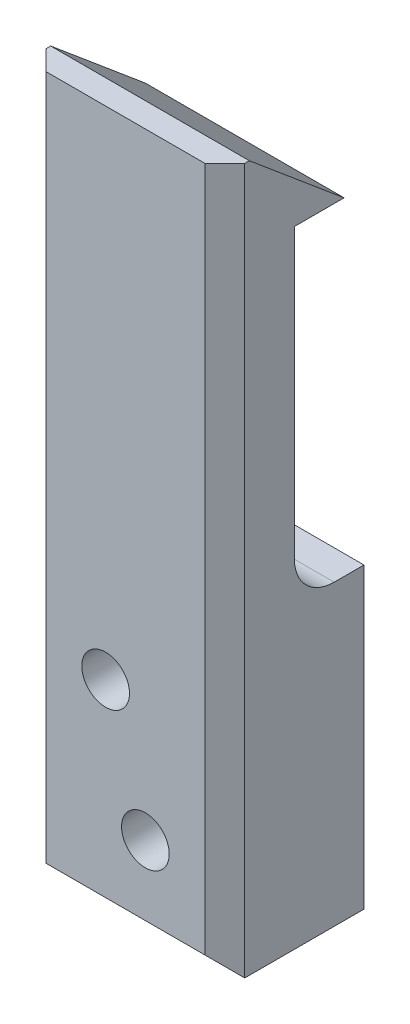
ISO-10303-21;
HEADER;
FILE_DESCRIPTION(('STEP AP214'),'2;1');
FILE_NAME('part.step','',(''),(''),'','','');
FILE_SCHEMA(('AUTOMOTIVE_DESIGN { 1 0 10303 214 1 1 1 1 }'));
ENDSEC;
DATA;
#1=APPLICATION_CONTEXT('core data for automotive mechanical design processes');
#2=APPLICATION_PROTOCOL_DEFINITION('international standard','automotive_design',2000,#1);
#3=PRODUCT_CONTEXT('',#1,'mechanical');
#4=PRODUCT('Part','Part','',(#3));
#5=PRODUCT_RELATED_PRODUCT_CATEGORY('part','',(#4));
#6=PRODUCT_DEFINITION_FORMATION('','',#4);
#7=PRODUCT_DEFINITION_CONTEXT('part definition',#1,'design');
#8=PRODUCT_DEFINITION('design','',#6,#7);
#9=PRODUCT_DEFINITION_SHAPE('','',#8);
#10=(LENGTH_UNIT() NAMED_UNIT(*) SI_UNIT(.MILLI.,.METRE.));
#11=(NAMED_UNIT(*) PLANE_ANGLE_UNIT() SI_UNIT($,.RADIAN.));
#12=(NAMED_UNIT(*) SI_UNIT($,.STERADIAN.) SOLID_ANGLE_UNIT());
#13=UNCERTAINTY_MEASURE_WITH_UNIT(LENGTH_MEASURE(1.E-05),#10,'distance_accuracy_value','');
#14=(GEOMETRIC_REPRESENTATION_CONTEXT(3) GLOBAL_UNCERTAINTY_ASSIGNED_CONTEXT((#13)) GLOBAL_UNIT_ASSIGNED_CONTEXT((#10,
#11,#12)) REPRESENTATION_CONTEXT('',''));
#15=CARTESIAN_POINT('',(0.,0.,0.));
#16=DIRECTION('',(0.,0.,1.));
#17=DIRECTION('',(1.,0.,0.));
#18=AXIS2_PLACEMENT_3D('',#15,#16,#17);
#19=CARTESIAN_POINT('',(-7.00000000000002,-14.0000000000004,1.49999999999998));
#20=DIRECTION('',(1.,0.,0.));
#21=DIRECTION('',(0.,1.,0.));
#22=AXIS2_PLACEMENT_3D('',#19,#20,#21);
#23=CYLINDRICAL_SURFACE('',#22,2.);
#24=CARTESIAN_POINT('',(2.99999999999999,-14.0000000000004,1.49999999999998));
#25=DIRECTION('',(1.,0.,0.));
#26=DIRECTION('',(0.,1.,0.));
#27=AXIS2_PLACEMENT_3D('',#24,#25,#26);
#28=CIRCLE('',#27,2.);
#29=CARTESIAN_POINT('',(2.99999999999999,-14.0000000000004,3.49999999999998));
#30=VERTEX_POINT('',#29);
#31=CARTESIAN_POINT('',(2.99999999999999,-16.0000000000004,1.49999999999997));
#32=VERTEX_POINT('',#31);
#33=EDGE_CURVE('E167',#30,#32,#28,.T.);
#34=ORIENTED_EDGE('',*,*,#33,.T.);
#35=DIRECTION('',(1.,0.,0.));
#36=VECTOR('',#35,1.);
#37=CARTESIAN_POINT('',(-7.00000000000001,-16.0000000000004,1.49999999999996));
#38=LINE('',#37,#36);
#39=CARTESIAN_POINT('',(-7.00000000000001,-16.0000000000004,1.49999999999996));
#40=VERTEX_POINT('',#39);
#41=EDGE_CURVE('E147',#40,#32,#38,.T.);
#42=ORIENTED_EDGE('',*,*,#41,.F.);
#43=CARTESIAN_POINT('',(-7.00000000000002,-14.0000000000004,1.49999999999998));
#44=DIRECTION('',(1.,0.,0.));
#45=DIRECTION('',(0.,1.,0.));
#46=AXIS2_PLACEMENT_3D('',#43,#44,#45);
#47=CIRCLE('',#46,2.);
#48=CARTESIAN_POINT('',(-7.00000000000002,-14.0000000000004,3.49999999999998));
#49=VERTEX_POINT('',#48);
#50=EDGE_CURVE('E127',#49,#40,#47,.T.);
#51=ORIENTED_EDGE('',*,*,#50,.F.);
#52=DIRECTION('',(1.,0.,0.));
#53=VECTOR('',#52,1.);
#54=CARTESIAN_POINT('',(-7.00000000000002,-14.0000000000004,3.49999999999998));
#55=LINE('',#54,#53);
#56=EDGE_CURVE('E136',#49,#30,#55,.T.);
#57=ORIENTED_EDGE('',*,*,#56,.T.);
#58=EDGE_LOOP('',(#34,#42,#51,#57));
#59=FACE_BOUND('',#58,.T.);
#60=ADVANCED_FACE('F37',(#59),#23,.F.);
#61=CARTESIAN_POINT('',(-7.00000000000001,-16.0000000000004,0.));
#62=DIRECTION('',(0.,-1.,0.));
#63=DIRECTION('',(1.,0.,0.));
#64=AXIS2_PLACEMENT_3D('',#61,#62,#63);
#65=PLANE('',#64);
#66=DIRECTION('',(0.,0.,-1.));
#67=VECTOR('',#66,1.);
#68=CARTESIAN_POINT('',(2.99999999999999,-16.0000000000004,0.));
#69=LINE('',#68,#67);
#70=CARTESIAN_POINT('',(2.99999999999999,-16.0000000000004,0.));
#71=VERTEX_POINT('',#70);
#72=EDGE_CURVE('E148',#32,#71,#69,.T.);
#73=ORIENTED_EDGE('',*,*,#72,.T.);
#74=DIRECTION('',(1.,0.,0.));
#75=VECTOR('',#74,1.);
#76=CARTESIAN_POINT('',(-7.00000000000001,-16.0000000000004,0.));
#77=LINE('',#76,#75);
#78=CARTESIAN_POINT('',(-7.00000000000001,-16.0000000000004,0.));
#79=VERTEX_POINT('',#78);
#80=EDGE_CURVE('E181',#79,#71,#77,.T.);
#81=ORIENTED_EDGE('',*,*,#80,.F.);
#82=DIRECTION('',(0.,0.,-1.));
#83=VECTOR('',#82,1.);
#84=CARTESIAN_POINT('',(-7.00000000000001,-16.0000000000004,0.));
#85=LINE('',#84,#83);
#86=EDGE_CURVE('E144',#40,#79,#85,.T.);
#87=ORIENTED_EDGE('',*,*,#86,.F.);
#88=ORIENTED_EDGE('',*,*,#41,.T.);
#89=EDGE_LOOP('',(#73,#81,#87,#88));
#90=FACE_BOUND('',#89,.T.);
#91=ADVANCED_FACE('F249',(#90),#65,.F.);
#92=CARTESIAN_POINT('',(-7.00000000000002,0.,0.));
#93=DIRECTION('',(0.,0.,1.));
#94=DIRECTION('',(0.,-1.,0.));
#95=AXIS2_PLACEMENT_3D('',#92,#93,#94);
#96=PLANE('',#95);
#97=CARTESIAN_POINT('',(-1.00000000000002,-26.5000000000002,0.));
#98=DIRECTION('',(0.,0.,1.));
#99=DIRECTION('',(1.,0.,0.));
#100=AXIS2_PLACEMENT_3D('',#97,#98,#99);
#101=CIRCLE('',#100,1.2);
#102=CARTESIAN_POINT('',(0.199999999999983,-26.5000000000002,0.));
#103=VERTEX_POINT('',#102);
#104=EDGE_CURVE('E219',#103,#103,#101,.T.);
#105=ORIENTED_EDGE('',*,*,#104,.T.);
#106=EDGE_LOOP('',(#105));
#107=FACE_BOUND('',#106,.T.);
#108=CARTESIAN_POINT('',(-3.00000000000002,-20.5000000000002,0.));
#109=DIRECTION('',(0.,0.,1.));
#110=DIRECTION('',(1.,0.,0.));
#111=AXIS2_PLACEMENT_3D('',#108,#109,#110);
#112=CIRCLE('',#111,1.2);
#113=CARTESIAN_POINT('',(-1.80000000000002,-20.5000000000002,0.));
#114=VERTEX_POINT('',#113);
#115=EDGE_CURVE('E153',#114,#114,#112,.T.);
#116=ORIENTED_EDGE('',*,*,#115,.T.);
#117=EDGE_LOOP('',(#116));
#118=FACE_BOUND('',#117,.T.);
#119=DIRECTION('',(0.,-1.,0.));
#120=VECTOR('',#119,1.);
#121=CARTESIAN_POINT('',(2.99999999999998,0.,0.));
#122=LINE('',#121,#120);
#123=CARTESIAN_POINT('',(2.99999999999999,-31.,0.));
#124=VERTEX_POINT('',#123);
#125=EDGE_CURVE('E150',#71,#124,#122,.T.);
#126=ORIENTED_EDGE('',*,*,#125,.T.);
#127=DIRECTION('',(1.,0.,0.));
#128=VECTOR('',#127,1.);
#129=CARTESIAN_POINT('',(-7.00000000000001,-31.,0.));
#130=LINE('',#129,#128);
#131=CARTESIAN_POINT('',(-7.00000000000001,-31.,0.));
#132=VERTEX_POINT('',#131);
#133=EDGE_CURVE('E184',#132,#124,#130,.T.);
#134=ORIENTED_EDGE('',*,*,#133,.F.);
#135=DIRECTION('',(0.,-1.,0.));
#136=VECTOR('',#135,1.);
#137=CARTESIAN_POINT('',(-7.00000000000002,0.,0.));
#138=LINE('',#137,#136);
#139=EDGE_CURVE('E164',#79,#132,#138,.T.);
#140=ORIENTED_EDGE('',*,*,#139,.F.);
#141=ORIENTED_EDGE('',*,*,#80,.T.);
#142=EDGE_LOOP('',(#126,#134,#140,#141));
#143=FACE_BOUND('',#142,.T.);
#144=ADVANCED_FACE('F232',(#107,#118,#143),#96,.F.);
#145=CARTESIAN_POINT('',(-7.00000000000001,-31.,0.));
#146=DIRECTION('',(0.,1.,0.));
#147=DIRECTION('',(-1.,0.,0.));
#148=AXIS2_PLACEMENT_3D('',#145,#146,#147);
#149=PLANE('',#148);
#150=DIRECTION('',(0.,0.,1.));
#151=VECTOR('',#150,1.);
#152=CARTESIAN_POINT('',(2.99999999999999,-31.,0.));
#153=LINE('',#152,#151);
#154=CARTESIAN_POINT('',(2.99999999999999,-31.,5.99999999999998));
#155=VERTEX_POINT('',#154);
#156=EDGE_CURVE('E176',#124,#155,#153,.T.);
#157=ORIENTED_EDGE('',*,*,#156,.T.);
#158=DIRECTION('',(-1.,0.,0.));
#159=VECTOR('',#158,1.);
#160=CARTESIAN_POINT('',(-7.00000000000001,-31.,5.99999999999998));
#161=LINE('',#160,#159);
#162=CARTESIAN_POINT('',(-7.00000000000001,-31.,5.99999999999998));
#163=VERTEX_POINT('',#162);
#164=EDGE_CURVE('E11',#155,#163,#161,.T.);
#165=ORIENTED_EDGE('',*,*,#164,.T.);
#166=DIRECTION('',(0.,0.,1.));
#167=VECTOR('',#166,1.);
#168=CARTESIAN_POINT('',(-7.00000000000001,-31.,0.));
#169=LINE('',#168,#167);
#170=EDGE_CURVE('E162',#132,#163,#169,.T.);
#171=ORIENTED_EDGE('',*,*,#170,.F.);
#172=ORIENTED_EDGE('',*,*,#133,.T.);
#173=EDGE_LOOP('',(#157,#165,#171,#172));
#174=FACE_BOUND('',#173,.T.);
#175=ADVANCED_FACE('F288',(#174),#149,.F.);
#176=CARTESIAN_POINT('',(-7.00000000000002,0.,6.99999999999998));
#177=DIRECTION('',(0.,0.,-1.));
#178=DIRECTION('',(-1.,0.,0.));
#179=AXIS2_PLACEMENT_3D('',#176,#177,#178);
#180=PLANE('',#179);
#181=DIRECTION('',(1.,0.,0.));
#182=VECTOR('',#181,1.);
#183=CARTESIAN_POINT('',(-7.00000000000002,4.5,6.99999999999998));
#184=LINE('',#183,#182);
#185=CARTESIAN_POINT('',(-6.00000000000002,4.5,6.99999999999998));
#186=VERTEX_POINT('',#185);
#187=CARTESIAN_POINT('',(1.99999999999999,4.50000000000001,6.99999999999998));
#188=VERTEX_POINT('',#187);
#189=EDGE_CURVE('E187',#186,#188,#184,.T.);
#190=ORIENTED_EDGE('',*,*,#189,.F.);
#191=DIRECTION('',(0.,-1.,0.));
#192=VECTOR('',#191,1.);
#193=CARTESIAN_POINT('',(-6.00000000000002,0.,6.99999999999998));
#194=LINE('',#193,#192);
#195=CARTESIAN_POINT('',(-6.00000000000002,-30.,6.99999999999998));
#196=VERTEX_POINT('',#195);
#197=EDGE_CURVE('E205',#186,#196,#194,.T.);
#198=ORIENTED_EDGE('',*,*,#197,.T.);
#199=DIRECTION('',(1.,0.,0.));
#200=VECTOR('',#199,1.);
#201=CARTESIAN_POINT('',(-7.00000000000001,-30.,6.99999999999998));
#202=LINE('',#201,#200);
#203=CARTESIAN_POINT('',(1.99999999999999,-30.,6.99999999999998));
#204=VERTEX_POINT('',#203);
#205=EDGE_CURVE('E61',#196,#204,#202,.T.);
#206=ORIENTED_EDGE('',*,*,#205,.T.);
#207=DIRECTION('',(0.,1.,0.));
#208=VECTOR('',#207,1.);
#209=CARTESIAN_POINT('',(1.99999999999999,4.50000000000001,6.99999999999998));
#210=LINE('',#209,#208);
#211=EDGE_CURVE('E203',#204,#188,#210,.T.);
#212=ORIENTED_EDGE('',*,*,#211,.T.);
#213=EDGE_LOOP('',(#190,#198,#206,#212));
#214=FACE_BOUND('',#213,.T.);
#215=CARTESIAN_POINT('',(-1.00000000000002,-26.5000000000002,6.99999999999998));
#216=DIRECTION('',(0.,0.,1.));
#217=DIRECTION('',(1.,0.,0.));
#218=AXIS2_PLACEMENT_3D('',#215,#216,#217);
#219=CIRCLE('',#218,1.2);
#220=CARTESIAN_POINT('',(0.199999999999983,-26.5000000000002,6.99999999999998));
#221=VERTEX_POINT('',#220);
#222=EDGE_CURVE('E214',#221,#221,#219,.T.);
#223=ORIENTED_EDGE('',*,*,#222,.F.);
#224=EDGE_LOOP('',(#223));
#225=FACE_BOUND('',#224,.T.);
#226=CARTESIAN_POINT('',(-3.00000000000002,-20.5000000000002,6.99999999999998));
#227=DIRECTION('',(0.,0.,1.));
#228=DIRECTION('',(1.,0.,0.));
#229=AXIS2_PLACEMENT_3D('',#226,#227,#228);
#230=CIRCLE('',#229,1.2);
#231=CARTESIAN_POINT('',(-1.80000000000002,-20.5000000000002,6.99999999999998));
#232=VERTEX_POINT('',#231);
#233=EDGE_CURVE('E224',#232,#232,#230,.T.);
#234=ORIENTED_EDGE('',*,*,#233,.F.);
#235=EDGE_LOOP('',(#234));
#236=FACE_BOUND('',#235,.T.);
#237=ADVANCED_FACE('F290',(#214,#225,#236),#180,.F.);
#238=CARTESIAN_POINT('',(-7.00000000000002,4.5,0.));
#239=DIRECTION('',(0.,1.,0.));
#240=DIRECTION('',(-1.,0.,0.));
#241=AXIS2_PLACEMENT_3D('',#238,#239,#240);
#242=PLANE('',#241);
#243=DIRECTION('',(0.,0.,1.));
#244=VECTOR('',#243,1.);
#245=CARTESIAN_POINT('',(-7.00000000000002,4.5,0.));
#246=LINE('',#245,#244);
#247=CARTESIAN_POINT('',(-7.00000000000002,4.5,5.76701437037688));
#248=VERTEX_POINT('',#247);
#249=CARTESIAN_POINT('',(-7.00000000000002,4.5,5.99999999999998));
#250=VERTEX_POINT('',#249);
#251=EDGE_CURVE('E159',#248,#250,#246,.T.);
#252=ORIENTED_EDGE('',*,*,#251,.T.);
#253=DIRECTION('',(-0.707106781186545,0.,-0.70710678118655));
#254=VECTOR('',#253,1.);
#255=CARTESIAN_POINT('',(-10.,4.5,2.99999999999996));
#256=LINE('',#255,#254);
#257=EDGE_CURVE('E200',#250,#186,#256,.F.);
#258=ORIENTED_EDGE('',*,*,#257,.T.);
#259=ORIENTED_EDGE('',*,*,#189,.T.);
#260=DIRECTION('',(0.707106781186545,0.,-0.70710678118655));
#261=VECTOR('',#260,1.);
#262=CARTESIAN_POINT('',(1.00000000000001,4.50000000000001,7.99999999999996));
#263=LINE('',#262,#261);
#264=CARTESIAN_POINT('',(2.99999999999998,4.50000000000001,5.99999999999998));
#265=VERTEX_POINT('',#264);
#266=EDGE_CURVE('E198',#188,#265,#263,.T.);
#267=ORIENTED_EDGE('',*,*,#266,.T.);
#268=DIRECTION('',(0.,0.,1.));
#269=VECTOR('',#268,1.);
#270=CARTESIAN_POINT('',(2.99999999999998,4.50000000000001,0.));
#271=LINE('',#270,#269);
#272=CARTESIAN_POINT('',(2.99999999999998,4.50000000000001,5.76701437037688));
#273=VERTEX_POINT('',#272);
#274=EDGE_CURVE('E174',#273,#265,#271,.T.);
#275=ORIENTED_EDGE('',*,*,#274,.F.);
#276=DIRECTION('',(1.,0.,0.));
#277=VECTOR('',#276,1.);
#278=CARTESIAN_POINT('',(-7.00000000000002,4.5,5.76701437037688));
#279=LINE('',#278,#277);
#280=EDGE_CURVE('E190',#248,#273,#279,.T.);
#281=ORIENTED_EDGE('',*,*,#280,.F.);
#282=EDGE_LOOP('',(#252,#258,#259,#267,#275,#281));
#283=FACE_BOUND('',#282,.T.);
#284=ADVANCED_FACE('F272',(#283),#242,.T.);
#285=CARTESIAN_POINT('',(-7.00000000000002,-0.198991832089356,0.166973972913467));
#286=DIRECTION('',(0.,-0.766044443118982,0.642787609686535));
#287=DIRECTION('',(0.,-0.642787609686535,-0.766044443118982));
#288=AXIS2_PLACEMENT_3D('',#285,#286,#287);
#289=PLANE('',#288);
#290=DIRECTION('',(0.,-0.642787609686535,-0.766044443118982));
#291=VECTOR('',#290,1.);
#292=CARTESIAN_POINT('',(2.99999999999998,-0.198991832089355,0.166973972913467));
#293=LINE('',#292,#291);
#294=CARTESIAN_POINT('',(2.99999999999998,0.500000000000006,0.999999999999982));
#295=VERTEX_POINT('',#294);
#296=EDGE_CURVE('E172',#273,#295,#293,.T.);
#297=ORIENTED_EDGE('',*,*,#296,.T.);
#298=DIRECTION('',(1.,0.,0.));
#299=VECTOR('',#298,1.);
#300=CARTESIAN_POINT('',(-7.00000000000002,0.500000000000005,0.999999999999981));
#301=LINE('',#300,#299);
#302=CARTESIAN_POINT('',(-7.00000000000002,0.500000000000005,0.999999999999981));
#303=VERTEX_POINT('',#302);
#304=EDGE_CURVE('E192',#303,#295,#301,.T.);
#305=ORIENTED_EDGE('',*,*,#304,.F.);
#306=DIRECTION('',(0.,-0.642787609686535,-0.766044443118982));
#307=VECTOR('',#306,1.);
#308=CARTESIAN_POINT('',(-7.00000000000002,-0.198991832089356,0.166973972913467));
#309=LINE('',#308,#307);
#310=EDGE_CURVE('E157',#248,#303,#309,.T.);
#311=ORIENTED_EDGE('',*,*,#310,.F.);
#312=ORIENTED_EDGE('',*,*,#280,.T.);
#313=EDGE_LOOP('',(#297,#305,#311,#312));
#314=FACE_BOUND('',#313,.T.);
#315=ADVANCED_FACE('F278',(#314),#289,.F.);
#316=CARTESIAN_POINT('',(-7.00000000000002,0.500000000000006,0.));
#317=DIRECTION('',(0.,1.,0.));
#318=DIRECTION('',(0.,0.,1.));
#319=AXIS2_PLACEMENT_3D('',#316,#317,#318);
#320=PLANE('',#319);
#321=DIRECTION('',(0.,0.,1.));
#322=VECTOR('',#321,1.);
#323=CARTESIAN_POINT('',(2.99999999999998,0.500000000000007,0.));
#324=LINE('',#323,#322);
#325=CARTESIAN_POINT('',(2.99999999999998,0.500000000000006,3.49999999999998));
#326=VERTEX_POINT('',#325);
#327=EDGE_CURVE('E170',#295,#326,#324,.T.);
#328=ORIENTED_EDGE('',*,*,#327,.T.);
#329=DIRECTION('',(1.,0.,0.));
#330=VECTOR('',#329,1.);
#331=CARTESIAN_POINT('',(-7.00000000000002,0.500000000000005,3.49999999999998));
#332=LINE('',#331,#330);
#333=CARTESIAN_POINT('',(-7.00000000000002,0.500000000000005,3.49999999999998));
#334=VERTEX_POINT('',#333);
#335=EDGE_CURVE('E143',#334,#326,#332,.T.);
#336=ORIENTED_EDGE('',*,*,#335,.F.);
#337=DIRECTION('',(0.,0.,1.));
#338=VECTOR('',#337,1.);
#339=CARTESIAN_POINT('',(-7.00000000000002,0.500000000000006,0.));
#340=LINE('',#339,#338);
#341=EDGE_CURVE('E130',#303,#334,#340,.T.);
#342=ORIENTED_EDGE('',*,*,#341,.F.);
#343=ORIENTED_EDGE('',*,*,#304,.T.);
#344=EDGE_LOOP('',(#328,#336,#342,#343));
#345=FACE_BOUND('',#344,.T.);
#346=ADVANCED_FACE('F281',(#345),#320,.F.);
#347=CARTESIAN_POINT('',(-7.00000000000002,0.,3.49999999999998));
#348=DIRECTION('',(0.,0.,1.));
#349=DIRECTION('',(0.,-1.,0.));
#350=AXIS2_PLACEMENT_3D('',#347,#348,#349);
#351=PLANE('',#350);
#352=DIRECTION('',(0.,-1.,0.));
#353=VECTOR('',#352,1.);
#354=CARTESIAN_POINT('',(2.99999999999998,0.,3.49999999999998));
#355=LINE('',#354,#353);
#356=EDGE_CURVE('E139',#326,#30,#355,.T.);
#357=ORIENTED_EDGE('',*,*,#356,.T.);
#358=ORIENTED_EDGE('',*,*,#56,.F.);
#359=DIRECTION('',(0.,-1.,0.));
#360=VECTOR('',#359,1.);
#361=CARTESIAN_POINT('',(-7.00000000000002,0.,3.49999999999998));
#362=LINE('',#361,#360);
#363=EDGE_CURVE('E122',#334,#49,#362,.T.);
#364=ORIENTED_EDGE('',*,*,#363,.F.);
#365=ORIENTED_EDGE('',*,*,#335,.T.);
#366=EDGE_LOOP('',(#357,#358,#364,#365));
#367=FACE_BOUND('',#366,.T.);
#368=ADVANCED_FACE('F137',(#367),#351,.F.);
#369=CARTESIAN_POINT('',(-7.00000000000002,0.,0.));
#370=DIRECTION('',(1.,0.,0.));
#371=DIRECTION('',(0.,1.,0.));
#372=AXIS2_PLACEMENT_3D('',#369,#370,#371);
#373=PLANE('',#372);
#374=ORIENTED_EDGE('',*,*,#170,.T.);
#375=DIRECTION('',(0.,1.,0.));
#376=VECTOR('',#375,1.);
#377=CARTESIAN_POINT('',(-7.00000000000002,0.,5.99999999999998));
#378=LINE('',#377,#376);
#379=EDGE_CURVE('E180',#163,#250,#378,.T.);
#380=ORIENTED_EDGE('',*,*,#379,.T.);
#381=ORIENTED_EDGE('',*,*,#251,.F.);
#382=ORIENTED_EDGE('',*,*,#310,.T.);
#383=ORIENTED_EDGE('',*,*,#341,.T.);
#384=ORIENTED_EDGE('',*,*,#363,.T.);
#385=ORIENTED_EDGE('',*,*,#50,.T.);
#386=ORIENTED_EDGE('',*,*,#86,.T.);
#387=ORIENTED_EDGE('',*,*,#139,.T.);
#388=EDGE_LOOP('',(#374,#380,#381,#382,#383,#384,#385,#386,#387));
#389=FACE_BOUND('',#388,.T.);
#390=ADVANCED_FACE('F125',(#389),#373,.F.);
#391=CARTESIAN_POINT('',(2.99999999999998,0.,0.));
#392=DIRECTION('',(1.,0.,0.));
#393=DIRECTION('',(0.,1.,0.));
#394=AXIS2_PLACEMENT_3D('',#391,#392,#393);
#395=PLANE('',#394);
#396=ORIENTED_EDGE('',*,*,#274,.T.);
#397=DIRECTION('',(0.,-1.,0.));
#398=VECTOR('',#397,1.);
#399=CARTESIAN_POINT('',(2.99999999999999,-31.,5.99999999999998));
#400=LINE('',#399,#398);
#401=EDGE_CURVE('E46',#265,#155,#400,.T.);
#402=ORIENTED_EDGE('',*,*,#401,.T.);
#403=ORIENTED_EDGE('',*,*,#156,.F.);
#404=ORIENTED_EDGE('',*,*,#125,.F.);
#405=ORIENTED_EDGE('',*,*,#72,.F.);
#406=ORIENTED_EDGE('',*,*,#33,.F.);
#407=ORIENTED_EDGE('',*,*,#356,.F.);
#408=ORIENTED_EDGE('',*,*,#327,.F.);
#409=ORIENTED_EDGE('',*,*,#296,.F.);
#410=EDGE_LOOP('',(#396,#402,#403,#404,#405,#406,#407,#408,#409));
#411=FACE_BOUND('',#410,.T.);
#412=ADVANCED_FACE('F238',(#411),#395,.T.);
#413=CARTESIAN_POINT('',(-3.00000000000002,-20.5000000000002,6.99999999999998));
#414=DIRECTION('',(0.,0.,1.));
#415=DIRECTION('',(1.,0.,0.));
#416=AXIS2_PLACEMENT_3D('',#413,#414,#415);
#417=CYLINDRICAL_SURFACE('',#416,1.2);
#418=ORIENTED_EDGE('',*,*,#115,.F.);
#419=EDGE_LOOP('',(#418));
#420=FACE_BOUND('',#419,.T.);
#421=ORIENTED_EDGE('',*,*,#233,.T.);
#422=EDGE_LOOP('',(#421));
#423=FACE_BOUND('',#422,.T.);
#424=ADVANCED_FACE('F235',(#420,#423),#417,.F.);
#425=CARTESIAN_POINT('',(-1.00000000000002,-26.5000000000002,6.99999999999998));
#426=DIRECTION('',(0.,0.,1.));
#427=DIRECTION('',(1.,0.,0.));
#428=AXIS2_PLACEMENT_3D('',#425,#426,#427);
#429=CYLINDRICAL_SURFACE('',#428,1.2);
#430=ORIENTED_EDGE('',*,*,#104,.F.);
#431=EDGE_LOOP('',(#430));
#432=FACE_BOUND('',#431,.T.);
#433=ORIENTED_EDGE('',*,*,#222,.T.);
#434=EDGE_LOOP('',(#433));
#435=FACE_BOUND('',#434,.T.);
#436=ADVANCED_FACE('F237',(#432,#435),#429,.F.);
#437=CARTESIAN_POINT('',(1.99999999999999,0.,6.99999999999998));
#438=DIRECTION('',(0.70710678118655,0.,0.707106781186545));
#439=DIRECTION('',(0.,-1.,0.));
#440=AXIS2_PLACEMENT_3D('',#437,#438,#439);
#441=PLANE('',#440);
#442=ORIENTED_EDGE('',*,*,#266,.F.);
#443=ORIENTED_EDGE('',*,*,#211,.F.);
#444=DIRECTION('',(0.577350269189624,-0.577350269189625,-0.577350269189629));
#445=VECTOR('',#444,1.);
#446=CARTESIAN_POINT('',(-0.999999999999988,-27.,9.99999999999999));
#447=LINE('',#446,#445);
#448=EDGE_CURVE('E41',#155,#204,#447,.F.);
#449=ORIENTED_EDGE('',*,*,#448,.F.);
#450=ORIENTED_EDGE('',*,*,#401,.F.);
#451=EDGE_LOOP('',(#442,#443,#449,#450));
#452=FACE_BOUND('',#451,.T.);
#453=ADVANCED_FACE('F39',(#452),#441,.T.);
#454=CARTESIAN_POINT('',(-7.00000000000001,-30.,6.99999999999998));
#455=DIRECTION('',(0.,0.70710678118655,-0.707106781186545));
#456=DIRECTION('',(1.,0.,0.));
#457=AXIS2_PLACEMENT_3D('',#454,#455,#456);
#458=PLANE('',#457);
#459=ORIENTED_EDGE('',*,*,#448,.T.);
#460=ORIENTED_EDGE('',*,*,#205,.F.);
#461=DIRECTION('',(-0.577350269189624,-0.577350269189625,-0.577350269189629));
#462=VECTOR('',#461,1.);
#463=CARTESIAN_POINT('',(-6.33333333333335,-30.3333333333333,6.66666666666665));
#464=LINE('',#463,#462);
#465=EDGE_CURVE('E207',#163,#196,#464,.F.);
#466=ORIENTED_EDGE('',*,*,#465,.F.);
#467=ORIENTED_EDGE('',*,*,#164,.F.);
#468=EDGE_LOOP('',(#459,#460,#466,#467));
#469=FACE_BOUND('',#468,.T.);
#470=ADVANCED_FACE('F261',(#469),#458,.F.);
#471=CARTESIAN_POINT('',(-7.00000000000002,0.,5.99999999999998));
#472=DIRECTION('',(0.70710678118655,0.,-0.707106781186545));
#473=DIRECTION('',(0.,1.,0.));
#474=AXIS2_PLACEMENT_3D('',#471,#472,#473);
#475=PLANE('',#474);
#476=ORIENTED_EDGE('',*,*,#465,.T.);
#477=ORIENTED_EDGE('',*,*,#197,.F.);
#478=ORIENTED_EDGE('',*,*,#257,.F.);
#479=ORIENTED_EDGE('',*,*,#379,.F.);
#480=EDGE_LOOP('',(#476,#477,#478,#479));
#481=FACE_BOUND('',#480,.T.);
#482=ADVANCED_FACE('F259',(#481),#475,.F.);
#483=CLOSED_SHELL('',(#60,#91,#144,#175,#237,#284,#315,#346,#368,#390,#412,#424,#436,#453,#470,#482));
#484=MANIFOLD_SOLID_BREP('B2',#483);
#485=ADVANCED_BREP_SHAPE_REPRESENTATION('',(#18,#484),#14);
#486=SHAPE_DEFINITION_REPRESENTATION(#9,#485);
ENDSEC;
END-ISO-10303-21;
